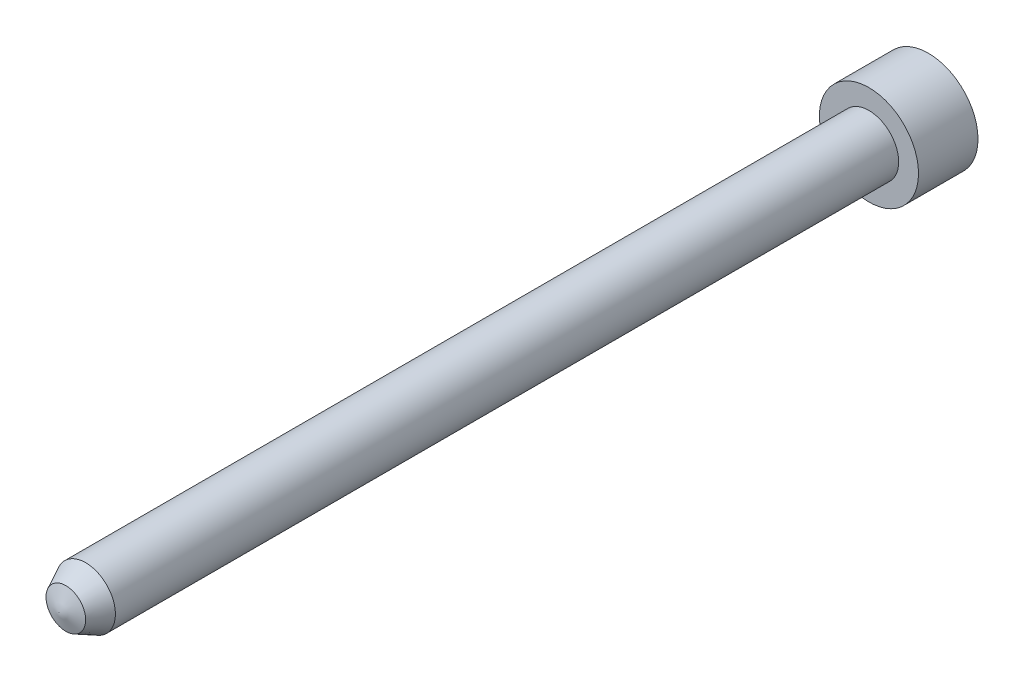
ISO-10303-21;
HEADER;
FILE_DESCRIPTION(('STEP AP214'),'2;1');
FILE_NAME('part.step','',(''),(''),'','','');
FILE_SCHEMA(('AUTOMOTIVE_DESIGN { 1 0 10303 214 1 1 1 1 }'));
ENDSEC;
DATA;
#1=APPLICATION_CONTEXT('core data for automotive mechanical design processes');
#2=APPLICATION_PROTOCOL_DEFINITION('international standard','automotive_design',2000,#1);
#3=PRODUCT_CONTEXT('',#1,'mechanical');
#4=PRODUCT('Part','Part','',(#3));
#5=PRODUCT_RELATED_PRODUCT_CATEGORY('part','',(#4));
#6=PRODUCT_DEFINITION_FORMATION('','',#4);
#7=PRODUCT_DEFINITION_CONTEXT('part definition',#1,'design');
#8=PRODUCT_DEFINITION('design','',#6,#7);
#9=PRODUCT_DEFINITION_SHAPE('','',#8);
#10=(LENGTH_UNIT() NAMED_UNIT(*) SI_UNIT(.MILLI.,.METRE.));
#11=(NAMED_UNIT(*) PLANE_ANGLE_UNIT() SI_UNIT($,.RADIAN.));
#12=(NAMED_UNIT(*) SI_UNIT($,.STERADIAN.) SOLID_ANGLE_UNIT());
#13=UNCERTAINTY_MEASURE_WITH_UNIT(LENGTH_MEASURE(1.E-05),#10,'distance_accuracy_value','');
#14=(GEOMETRIC_REPRESENTATION_CONTEXT(3) GLOBAL_UNCERTAINTY_ASSIGNED_CONTEXT((#13)) GLOBAL_UNIT_ASSIGNED_CONTEXT((#10,
#11,#12)) REPRESENTATION_CONTEXT('',''));
#15=CARTESIAN_POINT('',(0.,0.,0.));
#16=DIRECTION('',(0.,0.,1.));
#17=DIRECTION('',(1.,0.,0.));
#18=AXIS2_PLACEMENT_3D('',#15,#16,#17);
#19=CARTESIAN_POINT('',(860.,-225.,318.));
#20=DIRECTION('',(0.,0.,-1.));
#21=DIRECTION('',(-1.,0.,0.));
#22=AXIS2_PLACEMENT_3D('',#19,#20,#21);
#23=CYLINDRICAL_SURFACE('',#22,15.);
#24=CARTESIAN_POINT('',(860.,-225.,318.));
#25=DIRECTION('',(0.,0.,1.));
#26=DIRECTION('',(1.,0.,0.));
#27=AXIS2_PLACEMENT_3D('',#24,#25,#26);
#28=CIRCLE('',#27,15.);
#29=CARTESIAN_POINT('',(875.,-225.,318.));
#30=VERTEX_POINT('',#29);
#31=EDGE_CURVE('E49',#30,#30,#28,.T.);
#32=ORIENTED_EDGE('',*,*,#31,.F.);
#33=EDGE_LOOP('',(#32));
#34=FACE_BOUND('',#33,.T.);
#35=CARTESIAN_POINT('',(860.,-225.,300.));
#36=DIRECTION('',(0.,0.,1.));
#37=DIRECTION('',(1.,0.,0.));
#38=AXIS2_PLACEMENT_3D('',#35,#36,#37);
#39=CIRCLE('',#38,15.);
#40=CARTESIAN_POINT('',(875.,-225.,300.));
#41=VERTEX_POINT('',#40);
#42=EDGE_CURVE('E46',#41,#41,#39,.T.);
#43=ORIENTED_EDGE('',*,*,#42,.T.);
#44=EDGE_LOOP('',(#43));
#45=FACE_BOUND('',#44,.T.);
#46=ADVANCED_FACE('F43',(#34,#45),#23,.T.);
#47=CARTESIAN_POINT('',(860.,-225.,318.));
#48=DIRECTION('',(0.,0.,1.));
#49=DIRECTION('',(1.,0.,0.));
#50=AXIS2_PLACEMENT_3D('',#47,#48,#49);
#51=PLANE('',#50);
#52=CARTESIAN_POINT('',(860.,-225.,318.));
#53=DIRECTION('',(0.,0.,1.));
#54=DIRECTION('',(1.,0.,0.));
#55=AXIS2_PLACEMENT_3D('',#52,#53,#54);
#56=CIRCLE('',#55,9.00000000000001);
#57=CARTESIAN_POINT('',(869.,-225.,318.));
#58=VERTEX_POINT('',#57);
#59=EDGE_CURVE('E11',#58,#58,#56,.T.);
#60=ORIENTED_EDGE('',*,*,#59,.F.);
#61=EDGE_LOOP('',(#60));
#62=FACE_BOUND('',#61,.T.);
#63=ORIENTED_EDGE('',*,*,#31,.T.);
#64=EDGE_LOOP('',(#63));
#65=FACE_BOUND('',#64,.T.);
#66=ADVANCED_FACE('F67',(#62,#65),#51,.T.);
#67=CARTESIAN_POINT('',(860.,-225.,300.));
#68=DIRECTION('',(0.,0.,1.));
#69=DIRECTION('',(1.,0.,0.));
#70=AXIS2_PLACEMENT_3D('',#67,#68,#69);
#71=PLANE('',#70);
#72=ORIENTED_EDGE('',*,*,#42,.F.);
#73=EDGE_LOOP('',(#72));
#74=FACE_BOUND('',#73,.T.);
#75=ADVANCED_FACE('F71',(#74),#71,.F.);
#76=CARTESIAN_POINT('',(860.,-225.,555.));
#77=DIRECTION('',(0.,0.,-1.));
#78=DIRECTION('',(-1.,0.,0.));
#79=AXIS2_PLACEMENT_3D('',#76,#77,#78);
#80=CYLINDRICAL_SURFACE('',#79,9.00000000000001);
#81=CARTESIAN_POINT('',(860.,-225.,555.));
#82=DIRECTION('',(0.,0.,1.));
#83=DIRECTION('',(1.,0.,0.));
#84=AXIS2_PLACEMENT_3D('',#81,#82,#83);
#85=CIRCLE('',#84,9.00000000000001);
#86=CARTESIAN_POINT('',(869.,-225.,555.));
#87=VERTEX_POINT('',#86);
#88=EDGE_CURVE('E84',#87,#87,#85,.T.);
#89=ORIENTED_EDGE('',*,*,#88,.F.);
#90=EDGE_LOOP('',(#89));
#91=FACE_BOUND('',#90,.T.);
#92=ORIENTED_EDGE('',*,*,#59,.T.);
#93=EDGE_LOOP('',(#92));
#94=FACE_BOUND('',#93,.T.);
#95=ADVANCED_FACE('F64',(#91,#94),#80,.T.);
#96=CARTESIAN_POINT('',(860.,-225.,561.));
#97=DIRECTION('',(0.,0.,-1.));
#98=DIRECTION('',(-1.,0.,0.));
#99=AXIS2_PLACEMENT_3D('',#96,#97,#98);
#100=CONICAL_SURFACE('',#99,6.00000000000001,0.463647609000806);
#101=ORIENTED_EDGE('',*,*,#88,.T.);
#102=EDGE_LOOP('',(#101));
#103=FACE_BOUND('',#102,.T.);
#104=CARTESIAN_POINT('',(860.,-225.,561.));
#105=DIRECTION('',(0.,0.,-1.));
#106=DIRECTION('',(-1.,0.,0.));
#107=AXIS2_PLACEMENT_3D('',#104,#105,#106);
#108=CIRCLE('',#107,6.00000000000001);
#109=CARTESIAN_POINT('',(854.,-225.,561.));
#110=VERTEX_POINT('',#109);
#111=EDGE_CURVE('E81',#110,#110,#108,.T.);
#112=ORIENTED_EDGE('',*,*,#111,.T.);
#113=EDGE_LOOP('',(#112));
#114=FACE_BOUND('',#113,.T.);
#115=ADVANCED_FACE('F57',(#103,#114),#100,.T.);
#116=CARTESIAN_POINT('',(860.,-225.,563.));
#117=DIRECTION('',(0.,0.,-1.));
#118=DIRECTION('',(-1.,0.,0.));
#119=AXIS2_PLACEMENT_3D('',#116,#117,#118);
#120=CONICAL_SURFACE('',#119,0.,1.24904577239825);
#121=ORIENTED_EDGE('',*,*,#111,.F.);
#122=EDGE_LOOP('',(#121));
#123=FACE_BOUND('',#122,.T.);
#124=CARTESIAN_POINT('',(860.,-225.,563.));
#125=VERTEX_POINT('',#124);
#126=VERTEX_LOOP('',#125);
#127=FACE_BOUND('',#126,.T.);
#128=ADVANCED_FACE('F53',(#123,#127),#120,.T.);
#129=CLOSED_SHELL('',(#46,#66,#75,#95,#115,#128));
#130=MANIFOLD_SOLID_BREP('B2',#129);
#131=ADVANCED_BREP_SHAPE_REPRESENTATION('',(#18,#130),#14);
#132=SHAPE_DEFINITION_REPRESENTATION(#9,#131);
ENDSEC;
END-ISO-10303-21;
